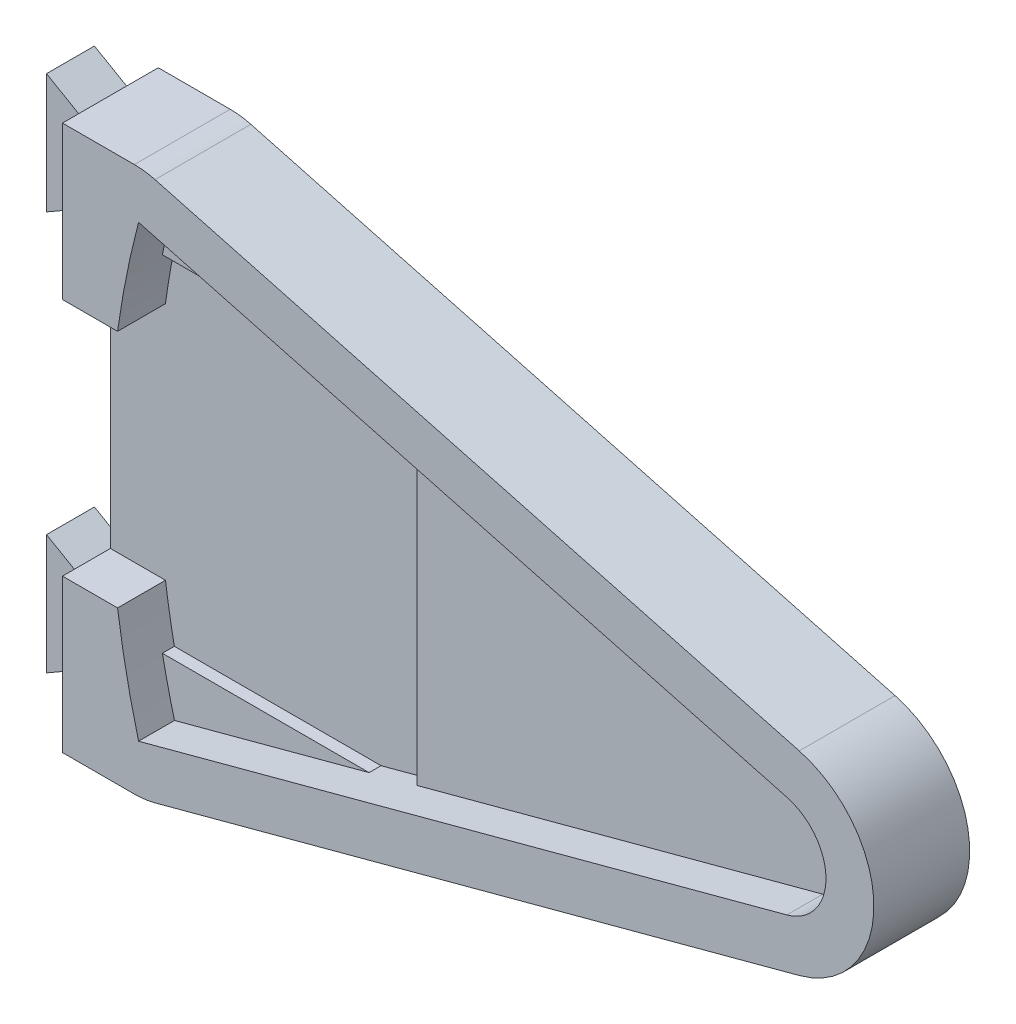
ISO-10303-21;
HEADER;
FILE_DESCRIPTION(('STEP AP214'),'2;1');
FILE_NAME('part.step','',(''),(''),'','','');
FILE_SCHEMA(('AUTOMOTIVE_DESIGN { 1 0 10303 214 1 1 1 1 }'));
ENDSEC;
DATA;
#1=APPLICATION_CONTEXT('core data for automotive mechanical design processes');
#2=APPLICATION_PROTOCOL_DEFINITION('international standard','automotive_design',2000,#1);
#3=PRODUCT_CONTEXT('',#1,'mechanical');
#4=PRODUCT('Part','Part','',(#3));
#5=PRODUCT_RELATED_PRODUCT_CATEGORY('part','',(#4));
#6=PRODUCT_DEFINITION_FORMATION('','',#4);
#7=PRODUCT_DEFINITION_CONTEXT('part definition',#1,'design');
#8=PRODUCT_DEFINITION('design','',#6,#7);
#9=PRODUCT_DEFINITION_SHAPE('','',#8);
#10=(LENGTH_UNIT() NAMED_UNIT(*) SI_UNIT(.MILLI.,.METRE.));
#11=(NAMED_UNIT(*) PLANE_ANGLE_UNIT() SI_UNIT($,.RADIAN.));
#12=(NAMED_UNIT(*) SI_UNIT($,.STERADIAN.) SOLID_ANGLE_UNIT());
#13=UNCERTAINTY_MEASURE_WITH_UNIT(LENGTH_MEASURE(1.E-05),#10,'distance_accuracy_value','');
#14=(GEOMETRIC_REPRESENTATION_CONTEXT(3) GLOBAL_UNCERTAINTY_ASSIGNED_CONTEXT((#13)) GLOBAL_UNIT_ASSIGNED_CONTEXT((#10,
#11,#12)) REPRESENTATION_CONTEXT('',''));
#15=CARTESIAN_POINT('',(0.,0.,0.));
#16=DIRECTION('',(0.,0.,1.));
#17=DIRECTION('',(1.,0.,0.));
#18=AXIS2_PLACEMENT_3D('',#15,#16,#17);
#19=CARTESIAN_POINT('',(20.4999999999858,-1.0639238671237E-11,12.));
#20=DIRECTION('',(0.,0.,-1.));
#21=DIRECTION('',(-1.,0.,0.));
#22=AXIS2_PLACEMENT_3D('',#19,#20,#21);
#23=CYLINDRICAL_SURFACE('',#22,110.12699999999);
#24=CARTESIAN_POINT('',(20.4999999999858,-1.0639238671237E-11,7.5));
#25=DIRECTION('',(0.,0.,1.));
#26=DIRECTION('',(-1.,0.,0.));
#27=AXIS2_PLACEMENT_3D('',#24,#25,#26);
#28=CIRCLE('',#27,110.126999999985);
#29=CARTESIAN_POINT('',(-87.4856820991366,-21.6113070077797,7.5));
#30=VERTEX_POINT('',#29);
#31=CARTESIAN_POINT('',(-85.9704428223746,-28.1425111567462,7.5));
#32=VERTEX_POINT('',#31);
#33=EDGE_CURVE('E445',#30,#32,#28,.T.);
#34=ORIENTED_EDGE('',*,*,#33,.F.);
#35=DIRECTION('',(0.,0.,-1.));
#36=VECTOR('',#35,1.);
#37=CARTESIAN_POINT('',(-87.4856820991366,-21.6113070077797,7.5));
#38=LINE('',#37,#36);
#39=CARTESIAN_POINT('',(-87.4856820991366,-21.6113070077797,6.));
#40=VERTEX_POINT('',#39);
#41=EDGE_CURVE('E444',#30,#40,#38,.T.);
#42=ORIENTED_EDGE('',*,*,#41,.T.);
#43=CARTESIAN_POINT('',(20.4999999999858,-1.0639238671237E-11,6.));
#44=DIRECTION('',(0.,0.,1.));
#45=DIRECTION('',(1.,0.,0.));
#46=AXIS2_PLACEMENT_3D('',#43,#44,#45);
#47=CIRCLE('',#46,110.12699999999);
#48=CARTESIAN_POINT('',(-88.6006697000578,-15.,6.));
#49=VERTEX_POINT('',#48);
#50=EDGE_CURVE('E421',#49,#40,#47,.T.);
#51=ORIENTED_EDGE('',*,*,#50,.F.);
#52=DIRECTION('',(0.,0.,-1.));
#53=VECTOR('',#52,1.);
#54=CARTESIAN_POINT('',(-88.6006697000578,-15.,12.));
#55=LINE('',#54,#53);
#56=CARTESIAN_POINT('',(-88.6006697000578,-15.,12.));
#57=VERTEX_POINT('',#56);
#58=EDGE_CURVE('E441',#57,#49,#55,.T.);
#59=ORIENTED_EDGE('',*,*,#58,.F.);
#60=CARTESIAN_POINT('',(20.4999999999858,-1.0639238671237E-11,12.));
#61=DIRECTION('',(0.,0.,1.));
#62=DIRECTION('',(1.,0.,0.));
#63=AXIS2_PLACEMENT_3D('',#60,#61,#62);
#64=CIRCLE('',#63,110.12699999999);
#65=CARTESIAN_POINT('',(-85.9704428223794,-28.1425111567494,12.));
#66=VERTEX_POINT('',#65);
#67=EDGE_CURVE('E416',#57,#66,#64,.T.);
#68=ORIENTED_EDGE('',*,*,#67,.T.);
#69=DIRECTION('',(0.,0.,-1.));
#70=VECTOR('',#69,1.);
#71=CARTESIAN_POINT('',(-85.9704428223794,-28.1425111567494,12.));
#72=LINE('',#71,#70);
#73=EDGE_CURVE('E265',#66,#32,#72,.T.);
#74=ORIENTED_EDGE('',*,*,#73,.T.);
#75=EDGE_LOOP('',(#34,#42,#51,#59,#68,#74));
#76=FACE_BOUND('',#75,.T.);
#77=ADVANCED_FACE('F41',(#76),#23,.F.);
#78=CARTESIAN_POINT('',(1.27670010738643,4.76470966679497,12.));
#79=DIRECTION('',(0.258819045102511,0.965925826289071,0.));
#80=DIRECTION('',(-0.965925826289071,0.258819045102511,0.));
#81=AXIS2_PLACEMENT_3D('',#78,#79,#80);
#82=PLANE('',#81);
#83=DIRECTION('',(0.,0.,-1.));
#84=VECTOR('',#83,1.);
#85=CARTESIAN_POINT('',(-55.5821774841933,20.,7.5));
#86=LINE('',#85,#84);
#87=CARTESIAN_POINT('',(-55.5821774841933,20.,7.5));
#88=VERTEX_POINT('',#87);
#89=CARTESIAN_POINT('',(-55.5821774841933,19.9999999999982,6.));
#90=VERTEX_POINT('',#89);
#91=EDGE_CURVE('E56',#88,#90,#86,.T.);
#92=ORIENTED_EDGE('',*,*,#91,.F.);
#93=DIRECTION('',(-0.965925826289062,0.258819045102543,0.));
#94=VECTOR('',#93,1.);
#95=CARTESIAN_POINT('',(-55.5821774841933,20.,7.5));
#96=LINE('',#95,#94);
#97=CARTESIAN_POINT('',(-4.77292040587628,6.3857005978384,7.5));
#98=VERTEX_POINT('',#97);
#99=EDGE_CURVE('E258',#98,#88,#96,.T.);
#100=ORIENTED_EDGE('',*,*,#99,.F.);
#101=DIRECTION('',(0.,0.,-1.));
#102=VECTOR('',#101,1.);
#103=CARTESIAN_POINT('',(-4.77292040587628,6.3857005978384,12.));
#104=LINE('',#103,#102);
#105=CARTESIAN_POINT('',(-4.77292040587628,6.3857005978384,12.));
#106=VERTEX_POINT('',#105);
#107=EDGE_CURVE('E257',#106,#98,#104,.T.);
#108=ORIENTED_EDGE('',*,*,#107,.F.);
#109=DIRECTION('',(0.965925826289071,-0.258819045102511,0.));
#110=VECTOR('',#109,1.);
#111=CARTESIAN_POINT('',(1.27670010738643,4.76470966679497,12.));
#112=LINE('',#111,#110);
#113=CARTESIAN_POINT('',(-85.9704428223746,28.1425111567462,12.));
#114=VERTEX_POINT('',#113);
#115=EDGE_CURVE('E413',#114,#106,#112,.T.);
#116=ORIENTED_EDGE('',*,*,#115,.F.);
#117=DIRECTION('',(0.,0.,-1.));
#118=VECTOR('',#117,1.);
#119=CARTESIAN_POINT('',(-85.9704428223746,28.1425111567462,12.));
#120=LINE('',#119,#118);
#121=CARTESIAN_POINT('',(-85.9704428223746,28.1425111567462,7.5));
#122=VERTEX_POINT('',#121);
#123=EDGE_CURVE('E268',#114,#122,#120,.T.);
#124=ORIENTED_EDGE('',*,*,#123,.T.);
#125=DIRECTION('',(-0.965925826289071,0.258819045102511,0.));
#126=VECTOR('',#125,1.);
#127=CARTESIAN_POINT('',(-85.9704428223746,28.1425111567462,7.5));
#128=LINE('',#127,#126);
#129=CARTESIAN_POINT('',(-61.5956571038259,21.6113070077797,7.5));
#130=VERTEX_POINT('',#129);
#131=EDGE_CURVE('E462',#130,#122,#128,.T.);
#132=ORIENTED_EDGE('',*,*,#131,.F.);
#133=DIRECTION('',(0.,0.,-1.));
#134=VECTOR('',#133,1.);
#135=CARTESIAN_POINT('',(-61.5956571038259,21.6113070077797,7.5));
#136=LINE('',#135,#134);
#137=CARTESIAN_POINT('',(-61.5956571038259,21.6113070077797,6.));
#138=VERTEX_POINT('',#137);
#139=EDGE_CURVE('E459',#130,#138,#136,.T.);
#140=ORIENTED_EDGE('',*,*,#139,.T.);
#141=DIRECTION('',(0.965925826289071,-0.258819045102511,0.));
#142=VECTOR('',#141,1.);
#143=CARTESIAN_POINT('',(1.27670010738643,4.76470966679497,6.));
#144=LINE('',#143,#142);
#145=EDGE_CURVE('E419',#138,#90,#144,.T.);
#146=ORIENTED_EDGE('',*,*,#145,.T.);
#147=EDGE_LOOP('',(#92,#100,#108,#116,#124,#132,#140,#146));
#148=FACE_BOUND('',#147,.T.);
#149=ADVANCED_FACE('F532',(#148),#82,.F.);
#150=CARTESIAN_POINT('',(-87.4856820991366,21.6113070077797,6.));
#151=VERTEX_POINT('',#150);
#152=CARTESIAN_POINT('',(-88.6006697000549,15.,6.));
#153=VERTEX_POINT('',#152);
#154=EDGE_CURVE('E423',#151,#153,#47,.T.);
#155=ORIENTED_EDGE('',*,*,#154,.F.);
#156=DIRECTION('',(0.,0.,-1.));
#157=VECTOR('',#156,1.);
#158=CARTESIAN_POINT('',(-87.4856820991366,21.6113070077797,7.5));
#159=LINE('',#158,#157);
#160=CARTESIAN_POINT('',(-87.4856820991366,21.6113070077797,7.5));
#161=VERTEX_POINT('',#160);
#162=EDGE_CURVE('E457',#161,#151,#159,.T.);
#163=ORIENTED_EDGE('',*,*,#162,.F.);
#164=CARTESIAN_POINT('',(20.4999999999858,-1.0639238671237E-11,7.5));
#165=DIRECTION('',(0.,0.,1.));
#166=DIRECTION('',(1.,0.,0.));
#167=AXIS2_PLACEMENT_3D('',#164,#165,#166);
#168=CIRCLE('',#167,110.12699999999);
#169=EDGE_CURVE('E464',#122,#161,#168,.T.);
#170=ORIENTED_EDGE('',*,*,#169,.F.);
#171=ORIENTED_EDGE('',*,*,#123,.F.);
#172=CARTESIAN_POINT('',(-88.6006697000549,15.,12.));
#173=VERTEX_POINT('',#172);
#174=EDGE_CURVE('E270',#114,#173,#64,.T.);
#175=ORIENTED_EDGE('',*,*,#174,.T.);
#176=DIRECTION('',(0.,0.,-1.));
#177=VECTOR('',#176,1.);
#178=CARTESIAN_POINT('',(-88.6006697000549,15.,12.));
#179=LINE('',#178,#177);
#180=EDGE_CURVE('E480',#153,#173,#179,.F.);
#181=ORIENTED_EDGE('',*,*,#180,.F.);
#182=EDGE_LOOP('',(#155,#163,#170,#171,#175,#181));
#183=FACE_BOUND('',#182,.T.);
#184=ADVANCED_FACE('F534',(#183),#23,.F.);
#185=CARTESIAN_POINT('',(1.27670010738684,-4.76470966679645,12.));
#186=DIRECTION('',(0.258819045102514,-0.96592582628907,0.));
#187=DIRECTION('',(0.96592582628907,0.258819045102514,0.));
#188=AXIS2_PLACEMENT_3D('',#185,#186,#187);
#189=PLANE('',#188);
#190=DIRECTION('',(0.,0.,-1.));
#191=VECTOR('',#190,1.);
#192=CARTESIAN_POINT('',(-55.5821774841933,-20.,7.5));
#193=LINE('',#192,#191);
#194=CARTESIAN_POINT('',(-55.5821774841933,-20.,7.5));
#195=VERTEX_POINT('',#194);
#196=CARTESIAN_POINT('',(-55.5821774841933,-20.,6.));
#197=VERTEX_POINT('',#196);
#198=EDGE_CURVE('E854',#195,#197,#193,.T.);
#199=ORIENTED_EDGE('',*,*,#198,.T.);
#200=DIRECTION('',(-0.96592582628907,-0.258819045102514,0.));
#201=VECTOR('',#200,1.);
#202=CARTESIAN_POINT('',(1.27670010738684,-4.76470966679645,6.));
#203=LINE('',#202,#201);
#204=CARTESIAN_POINT('',(-61.5956571038191,-21.6113070077797,6.));
#205=VERTEX_POINT('',#204);
#206=EDGE_CURVE('E273',#197,#205,#203,.T.);
#207=ORIENTED_EDGE('',*,*,#206,.T.);
#208=DIRECTION('',(0.,0.,-1.));
#209=VECTOR('',#208,1.);
#210=CARTESIAN_POINT('',(-61.5956571038259,-21.6113070077797,7.5));
#211=LINE('',#210,#209);
#212=CARTESIAN_POINT('',(-61.5956571038259,-21.6113070077797,7.5));
#213=VERTEX_POINT('',#212);
#214=EDGE_CURVE('E64',#213,#205,#211,.T.);
#215=ORIENTED_EDGE('',*,*,#214,.F.);
#216=DIRECTION('',(0.965925826289071,0.258819045102511,0.));
#217=VECTOR('',#216,1.);
#218=CARTESIAN_POINT('',(-85.9704428223746,-28.1425111567462,7.5));
#219=LINE('',#218,#217);
#220=EDGE_CURVE('E448',#32,#213,#219,.T.);
#221=ORIENTED_EDGE('',*,*,#220,.F.);
#222=ORIENTED_EDGE('',*,*,#73,.F.);
#223=DIRECTION('',(-0.96592582628907,-0.258819045102514,0.));
#224=VECTOR('',#223,1.);
#225=CARTESIAN_POINT('',(1.27670010738684,-4.76470966679645,12.));
#226=LINE('',#225,#224);
#227=CARTESIAN_POINT('',(-4.77292040587472,-6.38570059783959,12.));
#228=VERTEX_POINT('',#227);
#229=EDGE_CURVE('E263',#228,#66,#226,.T.);
#230=ORIENTED_EDGE('',*,*,#229,.F.);
#231=DIRECTION('',(0.,0.,-1.));
#232=VECTOR('',#231,1.);
#233=CARTESIAN_POINT('',(-4.77292040587472,-6.38570059783959,12.));
#234=LINE('',#233,#232);
#235=CARTESIAN_POINT('',(-4.77292040587473,-6.38570059783959,7.5));
#236=VERTEX_POINT('',#235);
#237=EDGE_CURVE('E254',#228,#236,#234,.T.);
#238=ORIENTED_EDGE('',*,*,#237,.T.);
#239=DIRECTION('',(0.96592582628907,0.258819045102514,0.));
#240=VECTOR('',#239,1.);
#241=CARTESIAN_POINT('',(-4.77292040587472,-6.38570059783959,7.5));
#242=LINE('',#241,#240);
#243=EDGE_CURVE('E239',#195,#236,#242,.T.);
#244=ORIENTED_EDGE('',*,*,#243,.F.);
#245=EDGE_LOOP('',(#199,#207,#215,#221,#222,#230,#238,#244));
#246=FACE_BOUND('',#245,.T.);
#247=ADVANCED_FACE('F260',(#246),#189,.F.);
#248=CARTESIAN_POINT('',(0.,0.,6.));
#249=DIRECTION('',(0.,0.,1.));
#250=DIRECTION('',(1.,0.,0.));
#251=AXIS2_PLACEMENT_3D('',#248,#249,#250);
#252=PLANE('',#251);
#253=ORIENTED_EDGE('',*,*,#206,.F.);
#254=DIRECTION('',(0.,-1.,0.));
#255=VECTOR('',#254,1.);
#256=CARTESIAN_POINT('',(-55.5821774841933,20.,6.));
#257=LINE('',#256,#255);
#258=EDGE_CURVE('E249',#90,#197,#257,.T.);
#259=ORIENTED_EDGE('',*,*,#258,.F.);
#260=ORIENTED_EDGE('',*,*,#145,.F.);
#261=DIRECTION('',(1.,0.,0.));
#262=VECTOR('',#261,1.);
#263=CARTESIAN_POINT('',(-87.4856820991366,21.6113070077797,6.));
#264=LINE('',#263,#262);
#265=EDGE_CURVE('E450',#151,#138,#264,.T.);
#266=ORIENTED_EDGE('',*,*,#265,.F.);
#267=ORIENTED_EDGE('',*,*,#154,.T.);
#268=DIRECTION('',(-1.,0.,0.));
#269=VECTOR('',#268,1.);
#270=CARTESIAN_POINT('',(-85.5000000000038,15.,6.));
#271=LINE('',#270,#269);
#272=CARTESIAN_POINT('',(-95.5000000000038,15.,6.));
#273=VERTEX_POINT('',#272);
#274=EDGE_CURVE('E482',#153,#273,#271,.T.);
#275=ORIENTED_EDGE('',*,*,#274,.T.);
#276=DIRECTION('',(0.,-1.,0.));
#277=VECTOR('',#276,1.);
#278=CARTESIAN_POINT('',(-95.5000000000038,15.,6.));
#279=LINE('',#278,#277);
#280=CARTESIAN_POINT('',(-95.5000000000038,-15.,6.));
#281=VERTEX_POINT('',#280);
#282=EDGE_CURVE('E473',#273,#281,#279,.T.);
#283=ORIENTED_EDGE('',*,*,#282,.T.);
#284=DIRECTION('',(-1.,0.,0.));
#285=VECTOR('',#284,1.);
#286=CARTESIAN_POINT('',(-85.5000000000038,-15.,6.));
#287=LINE('',#286,#285);
#288=EDGE_CURVE('E436',#49,#281,#287,.T.);
#289=ORIENTED_EDGE('',*,*,#288,.F.);
#290=ORIENTED_EDGE('',*,*,#50,.T.);
#291=DIRECTION('',(-1.,0.,0.));
#292=VECTOR('',#291,1.);
#293=CARTESIAN_POINT('',(-87.4856820991366,-21.6113070077797,6.));
#294=LINE('',#293,#292);
#295=EDGE_CURVE('E434',#205,#40,#294,.T.);
#296=ORIENTED_EDGE('',*,*,#295,.F.);
#297=EDGE_LOOP('',(#253,#259,#260,#266,#267,#275,#283,#289,#290,#296));
#298=FACE_BOUND('',#297,.T.);
#299=ADVANCED_FACE('F433',(#298),#252,.T.);
#300=CARTESIAN_POINT('',(-95.5000000000038,0.,6.));
#301=DIRECTION('',(1.,0.,0.));
#302=DIRECTION('',(0.,1.,0.));
#303=AXIS2_PLACEMENT_3D('',#300,#301,#302);
#304=PLANE('',#303);
#305=DIRECTION('',(0.,1.,0.));
#306=VECTOR('',#305,1.);
#307=CARTESIAN_POINT('',(-95.5000000000038,0.,12.));
#308=LINE('',#307,#306);
#309=CARTESIAN_POINT('',(-95.5000000000037,-34.1425111567482,12.));
#310=VERTEX_POINT('',#309);
#311=CARTESIAN_POINT('',(-95.5000000000038,-15.,12.));
#312=VERTEX_POINT('',#311);
#313=EDGE_CURVE('E298',#310,#312,#308,.T.);
#314=ORIENTED_EDGE('',*,*,#313,.T.);
#315=DIRECTION('',(0.,0.,1.));
#316=VECTOR('',#315,1.);
#317=CARTESIAN_POINT('',(-95.5000000000038,-15.,12.));
#318=LINE('',#317,#316);
#319=EDGE_CURVE('E475',#281,#312,#318,.T.);
#320=ORIENTED_EDGE('',*,*,#319,.F.);
#321=ORIENTED_EDGE('',*,*,#282,.F.);
#322=DIRECTION('',(0.,0.,-1.));
#323=VECTOR('',#322,1.);
#324=CARTESIAN_POINT('',(-95.5000000000038,15.,12.));
#325=LINE('',#324,#323);
#326=CARTESIAN_POINT('',(-95.5000000000038,15.,12.));
#327=VERTEX_POINT('',#326);
#328=EDGE_CURVE('E470',#327,#273,#325,.T.);
#329=ORIENTED_EDGE('',*,*,#328,.F.);
#330=CARTESIAN_POINT('',(-95.5000000000038,34.1425111567487,12.));
#331=VERTEX_POINT('',#330);
#332=EDGE_CURVE('E297',#327,#331,#308,.T.);
#333=ORIENTED_EDGE('',*,*,#332,.T.);
#334=DIRECTION('',(0.,0.,-1.));
#335=VECTOR('',#334,1.);
#336=CARTESIAN_POINT('',(-95.5000000000038,34.1425111567487,6.));
#337=LINE('',#336,#335);
#338=CARTESIAN_POINT('',(-95.5000000000038,34.1425111567487,0.));
#339=VERTEX_POINT('',#338);
#340=EDGE_CURVE('E330',#331,#339,#337,.T.);
#341=ORIENTED_EDGE('',*,*,#340,.T.);
#342=DIRECTION('',(0.,-1.,0.));
#343=VECTOR('',#342,1.);
#344=CARTESIAN_POINT('',(-95.5000000000038,0.,0.));
#345=LINE('',#344,#343);
#346=CARTESIAN_POINT('',(-95.5000000000037,27.881197846483,0.));
#347=VERTEX_POINT('',#346);
#348=EDGE_CURVE('E323',#339,#347,#345,.T.);
#349=ORIENTED_EDGE('',*,*,#348,.T.);
#350=DIRECTION('',(0.,0.,-1.));
#351=VECTOR('',#350,1.);
#352=CARTESIAN_POINT('',(-95.5000000000037,27.881197846483,6.));
#353=LINE('',#352,#351);
#354=CARTESIAN_POINT('',(-95.5000000000037,27.881197846483,6.));
#355=VERTEX_POINT('',#354);
#356=EDGE_CURVE('E422',#355,#347,#353,.T.);
#357=ORIENTED_EDGE('',*,*,#356,.F.);
#358=DIRECTION('',(0.,1.,0.));
#359=VECTOR('',#358,1.);
#360=CARTESIAN_POINT('',(-95.5000000000037,27.881197846483,6.));
#361=LINE('',#360,#359);
#362=CARTESIAN_POINT('',(-95.5000000000037,22.118802153517,6.));
#363=VERTEX_POINT('',#362);
#364=EDGE_CURVE('E488',#363,#355,#361,.T.);
#365=ORIENTED_EDGE('',*,*,#364,.F.);
#366=DIRECTION('',(0.,0.,-1.));
#367=VECTOR('',#366,1.);
#368=CARTESIAN_POINT('',(-95.5000000000037,22.118802153517,6.));
#369=LINE('',#368,#367);
#370=CARTESIAN_POINT('',(-95.5000000000038,22.118802153517,0.));
#371=VERTEX_POINT('',#370);
#372=EDGE_CURVE('E383',#363,#371,#369,.T.);
#373=ORIENTED_EDGE('',*,*,#372,.T.);
#374=CARTESIAN_POINT('',(-95.5000000000037,-22.118802153517,0.));
#375=VERTEX_POINT('',#374);
#376=EDGE_CURVE('E327',#371,#375,#345,.T.);
#377=ORIENTED_EDGE('',*,*,#376,.T.);
#378=DIRECTION('',(0.,0.,-1.));
#379=VECTOR('',#378,1.);
#380=CARTESIAN_POINT('',(-95.5000000000037,-22.118802153517,6.));
#381=LINE('',#380,#379);
#382=CARTESIAN_POINT('',(-95.5000000000037,-22.118802153517,6.));
#383=VERTEX_POINT('',#382);
#384=EDGE_CURVE('E380',#383,#375,#381,.T.);
#385=ORIENTED_EDGE('',*,*,#384,.F.);
#386=DIRECTION('',(0.,1.,0.));
#387=VECTOR('',#386,1.);
#388=CARTESIAN_POINT('',(-95.5000000000037,-22.118802153517,6.));
#389=LINE('',#388,#387);
#390=CARTESIAN_POINT('',(-95.5000000000037,-27.881197846483,6.));
#391=VERTEX_POINT('',#390);
#392=EDGE_CURVE('E408',#391,#383,#389,.T.);
#393=ORIENTED_EDGE('',*,*,#392,.F.);
#394=DIRECTION('',(0.,0.,-1.));
#395=VECTOR('',#394,1.);
#396=CARTESIAN_POINT('',(-95.5000000000037,-27.881197846483,6.));
#397=LINE('',#396,#395);
#398=CARTESIAN_POINT('',(-95.5000000000037,-27.881197846483,0.));
#399=VERTEX_POINT('',#398);
#400=EDGE_CURVE('E511',#391,#399,#397,.T.);
#401=ORIENTED_EDGE('',*,*,#400,.T.);
#402=CARTESIAN_POINT('',(-95.5000000000037,-34.1425111567482,0.));
#403=VERTEX_POINT('',#402);
#404=EDGE_CURVE('E322',#399,#403,#345,.T.);
#405=ORIENTED_EDGE('',*,*,#404,.T.);
#406=DIRECTION('',(0.,0.,-1.));
#407=VECTOR('',#406,1.);
#408=CARTESIAN_POINT('',(-95.5000000000037,-34.1425111567482,6.));
#409=LINE('',#408,#407);
#410=EDGE_CURVE('E326',#310,#403,#409,.T.);
#411=ORIENTED_EDGE('',*,*,#410,.F.);
#412=EDGE_LOOP('',(#314,#320,#321,#329,#333,#341,#349,#357,#365,#373,#377,#385,#393,#401,#405,#411));
#413=FACE_BOUND('',#412,.T.);
#414=ADVANCED_FACE('F378',(#413),#304,.F.);
#415=CARTESIAN_POINT('',(0.,-34.1425111567482,6.));
#416=DIRECTION('',(0.,1.,0.));
#417=DIRECTION('',(0.,0.,1.));
#418=AXIS2_PLACEMENT_3D('',#415,#416,#417);
#419=PLANE('',#418);
#420=DIRECTION('',(1.,0.,0.));
#421=VECTOR('',#420,1.);
#422=CARTESIAN_POINT('',(0.,-34.1425111567482,0.));
#423=LINE('',#422,#421);
#424=CARTESIAN_POINT('',(-86.4970528127294,-34.1425111567482,0.));
#425=VERTEX_POINT('',#424);
#426=EDGE_CURVE('E304',#403,#425,#423,.T.);
#427=ORIENTED_EDGE('',*,*,#426,.T.);
#428=DIRECTION('',(0.,0.,-1.));
#429=VECTOR('',#428,1.);
#430=CARTESIAN_POINT('',(-86.4970528127294,-34.1425111567482,6.));
#431=LINE('',#430,#429);
#432=CARTESIAN_POINT('',(-86.4970528127294,-34.1425111567482,12.));
#433=VERTEX_POINT('',#432);
#434=EDGE_CURVE('E11',#433,#425,#431,.T.);
#435=ORIENTED_EDGE('',*,*,#434,.F.);
#436=DIRECTION('',(-1.,0.,0.));
#437=VECTOR('',#436,1.);
#438=CARTESIAN_POINT('',(0.,-34.1425111567482,12.));
#439=LINE('',#438,#437);
#440=EDGE_CURVE('E301',#433,#310,#439,.T.);
#441=ORIENTED_EDGE('',*,*,#440,.T.);
#442=ORIENTED_EDGE('',*,*,#410,.T.);
#443=EDGE_LOOP('',(#427,#435,#441,#442));
#444=FACE_BOUND('',#443,.T.);
#445=ADVANCED_FACE('F43',(#444),#419,.F.);
#446=CARTESIAN_POINT('',(-86.4970528127293,-24.1425111567482,6.));
#447=DIRECTION('',(0.,0.,-1.));
#448=DIRECTION('',(-1.,0.,0.));
#449=AXIS2_PLACEMENT_3D('',#446,#447,#448);
#450=CYLINDRICAL_SURFACE('',#449,10.);
#451=CARTESIAN_POINT('',(-86.4970528127293,-24.1425111567482,0.));
#452=DIRECTION('',(0.,0.,1.));
#453=DIRECTION('',(1.,0.,0.));
#454=AXIS2_PLACEMENT_3D('',#451,#452,#453);
#455=CIRCLE('',#454,10.);
#456=CARTESIAN_POINT('',(-83.9088623617041,-33.8017694196389,0.));
#457=VERTEX_POINT('',#456);
#458=EDGE_CURVE('E307',#425,#457,#455,.T.);
#459=ORIENTED_EDGE('',*,*,#458,.T.);
#460=DIRECTION('',(0.,0.,-1.));
#461=VECTOR('',#460,1.);
#462=CARTESIAN_POINT('',(-83.9088623617041,-33.8017694196389,6.));
#463=LINE('',#462,#461);
#464=CARTESIAN_POINT('',(-83.9088623617042,-33.8017694196389,12.));
#465=VERTEX_POINT('',#464);
#466=EDGE_CURVE('E49',#465,#457,#463,.T.);
#467=ORIENTED_EDGE('',*,*,#466,.F.);
#468=CARTESIAN_POINT('',(-86.4970528127293,-24.1425111567482,12.));
#469=DIRECTION('',(0.,0.,1.));
#470=DIRECTION('',(1.,0.,0.));
#471=AXIS2_PLACEMENT_3D('',#468,#469,#470);
#472=CIRCLE('',#471,10.);
#473=EDGE_CURVE('E279',#433,#465,#472,.T.);
#474=ORIENTED_EDGE('',*,*,#473,.F.);
#475=ORIENTED_EDGE('',*,*,#434,.T.);
#476=EDGE_LOOP('',(#459,#467,#474,#475));
#477=FACE_BOUND('',#476,.T.);
#478=ADVANCED_FACE('F366',(#477),#450,.T.);
#479=CARTESIAN_POINT('',(2.8296143780016,-10.5602646245297,6.));
#480=DIRECTION('',(-0.258819045102514,0.96592582628907,0.));
#481=DIRECTION('',(-0.96592582628907,-0.258819045102514,0.));
#482=AXIS2_PLACEMENT_3D('',#479,#480,#481);
#483=PLANE('',#482);
#484=DIRECTION('',(0.96592582628907,0.258819045102514,0.));
#485=VECTOR('',#484,1.);
#486=CARTESIAN_POINT('',(2.8296143780016,-10.5602646245297,0.));
#487=LINE('',#486,#485);
#488=CARTESIAN_POINT('',(-3.22000613526089,-12.181255555573,0.));
#489=VERTEX_POINT('',#488);
#490=EDGE_CURVE('E309',#457,#489,#487,.T.);
#491=ORIENTED_EDGE('',*,*,#490,.T.);
#492=DIRECTION('',(0.,0.,-1.));
#493=VECTOR('',#492,1.);
#494=CARTESIAN_POINT('',(-3.22000613526089,-12.181255555573,6.));
#495=LINE('',#494,#493);
#496=CARTESIAN_POINT('',(-3.22000613526089,-12.181255555573,12.));
#497=VERTEX_POINT('',#496);
#498=EDGE_CURVE('E339',#497,#489,#495,.T.);
#499=ORIENTED_EDGE('',*,*,#498,.F.);
#500=DIRECTION('',(-0.96592582628907,-0.258819045102514,0.));
#501=VECTOR('',#500,1.);
#502=CARTESIAN_POINT('',(2.8296143780016,-10.5602646245296,12.));
#503=LINE('',#502,#501);
#504=EDGE_CURVE('E282',#497,#465,#503,.T.);
#505=ORIENTED_EDGE('',*,*,#504,.T.);
#506=ORIENTED_EDGE('',*,*,#466,.T.);
#507=EDGE_LOOP('',(#491,#499,#505,#506));
#508=FACE_BOUND('',#507,.T.);
#509=ADVANCED_FACE('F344',(#508),#483,.F.);
#510=CARTESIAN_POINT('',(-6.48396372417305,5.03610879276146E-13,6.));
#511=DIRECTION('',(0.,0.,-1.));
#512=DIRECTION('',(-1.,0.,0.));
#513=AXIS2_PLACEMENT_3D('',#510,#511,#512);
#514=CYLINDRICAL_SURFACE('',#513,12.6109637241731);
#515=CARTESIAN_POINT('',(-6.48396372417305,5.03610879276146E-13,0.));
#516=DIRECTION('',(0.,0.,1.));
#517=DIRECTION('',(1.,0.,0.));
#518=AXIS2_PLACEMENT_3D('',#515,#516,#517);
#519=CIRCLE('',#518,12.6109637241731);
#520=CARTESIAN_POINT('',(-3.22000613525971,12.1812555555737,0.));
#521=VERTEX_POINT('',#520);
#522=EDGE_CURVE('E311',#489,#521,#519,.T.);
#523=ORIENTED_EDGE('',*,*,#522,.T.);
#524=DIRECTION('',(0.,0.,-1.));
#525=VECTOR('',#524,1.);
#526=CARTESIAN_POINT('',(-3.22000613525971,12.1812555555737,6.));
#527=LINE('',#526,#525);
#528=CARTESIAN_POINT('',(-3.22000613525971,12.1812555555737,12.));
#529=VERTEX_POINT('',#528);
#530=EDGE_CURVE('E336',#529,#521,#527,.T.);
#531=ORIENTED_EDGE('',*,*,#530,.F.);
#532=CARTESIAN_POINT('',(-6.48396372417305,5.03610879276146E-13,12.));
#533=DIRECTION('',(0.,0.,1.));
#534=DIRECTION('',(1.,0.,0.));
#535=AXIS2_PLACEMENT_3D('',#532,#533,#534);
#536=CIRCLE('',#535,12.6109637241731);
#537=EDGE_CURVE('E285',#497,#529,#536,.T.);
#538=ORIENTED_EDGE('',*,*,#537,.F.);
#539=ORIENTED_EDGE('',*,*,#498,.T.);
#540=EDGE_LOOP('',(#523,#531,#538,#539));
#541=FACE_BOUND('',#540,.T.);
#542=ADVANCED_FACE('F354',(#541),#514,.T.);
#543=CARTESIAN_POINT('',(2.82961437800182,10.5602646245306,6.));
#544=DIRECTION('',(-0.258819045102512,-0.965925826289071,0.));
#545=DIRECTION('',(0.965925826289071,-0.258819045102512,0.));
#546=AXIS2_PLACEMENT_3D('',#543,#544,#545);
#547=PLANE('',#546);
#548=DIRECTION('',(-0.965925826289071,0.258819045102512,0.));
#549=VECTOR('',#548,1.);
#550=CARTESIAN_POINT('',(2.82961437800182,10.5602646245306,0.));
#551=LINE('',#550,#549);
#552=CARTESIAN_POINT('',(-83.9088623617026,33.8017694196393,0.));
#553=VERTEX_POINT('',#552);
#554=EDGE_CURVE('E313',#521,#553,#551,.T.);
#555=ORIENTED_EDGE('',*,*,#554,.T.);
#556=DIRECTION('',(0.,0.,-1.));
#557=VECTOR('',#556,1.);
#558=CARTESIAN_POINT('',(-83.9088623617026,33.8017694196393,6.));
#559=LINE('',#558,#557);
#560=CARTESIAN_POINT('',(-83.9088623617027,33.8017694196393,12.));
#561=VERTEX_POINT('',#560);
#562=EDGE_CURVE('E334',#561,#553,#559,.T.);
#563=ORIENTED_EDGE('',*,*,#562,.F.);
#564=DIRECTION('',(0.965925826289071,-0.258819045102512,0.));
#565=VECTOR('',#564,1.);
#566=CARTESIAN_POINT('',(2.82961437800182,10.5602646245306,12.));
#567=LINE('',#566,#565);
#568=EDGE_CURVE('E288',#561,#529,#567,.T.);
#569=ORIENTED_EDGE('',*,*,#568,.T.);
#570=ORIENTED_EDGE('',*,*,#530,.T.);
#571=EDGE_LOOP('',(#555,#563,#569,#570));
#572=FACE_BOUND('',#571,.T.);
#573=ADVANCED_FACE('F357',(#572),#547,.F.);
#574=CARTESIAN_POINT('',(-86.4970528127278,24.1425111567486,6.));
#575=DIRECTION('',(0.,0.,-1.));
#576=DIRECTION('',(-1.,0.,0.));
#577=AXIS2_PLACEMENT_3D('',#574,#575,#576);
#578=CYLINDRICAL_SURFACE('',#577,10.);
#579=CARTESIAN_POINT('',(-86.4970528127278,24.1425111567486,0.));
#580=DIRECTION('',(0.,0.,1.));
#581=DIRECTION('',(1.,0.,0.));
#582=AXIS2_PLACEMENT_3D('',#579,#580,#581);
#583=CIRCLE('',#582,10.);
#584=CARTESIAN_POINT('',(-86.497052812729,34.1425111567486,0.));
#585=VERTEX_POINT('',#584);
#586=EDGE_CURVE('E316',#585,#553,#583,.F.);
#587=ORIENTED_EDGE('',*,*,#586,.F.);
#588=DIRECTION('',(0.,0.,-1.));
#589=VECTOR('',#588,1.);
#590=CARTESIAN_POINT('',(-86.497052812729,34.1425111567486,6.));
#591=LINE('',#590,#589);
#592=CARTESIAN_POINT('',(-86.497052812729,34.1425111567486,12.));
#593=VERTEX_POINT('',#592);
#594=EDGE_CURVE('E332',#593,#585,#591,.T.);
#595=ORIENTED_EDGE('',*,*,#594,.F.);
#596=CARTESIAN_POINT('',(-86.4970528127278,24.1425111567486,12.));
#597=DIRECTION('',(0.,0.,1.));
#598=DIRECTION('',(1.,0.,0.));
#599=AXIS2_PLACEMENT_3D('',#596,#597,#598);
#600=CIRCLE('',#599,10.);
#601=EDGE_CURVE('E291',#561,#593,#600,.T.);
#602=ORIENTED_EDGE('',*,*,#601,.F.);
#603=ORIENTED_EDGE('',*,*,#562,.T.);
#604=EDGE_LOOP('',(#587,#595,#602,#603));
#605=FACE_BOUND('',#604,.T.);
#606=ADVANCED_FACE('F763',(#605),#578,.T.);
#607=CARTESIAN_POINT('',(6.05241697505847E-13,34.142511156747,6.));
#608=DIRECTION('',(0.,1.,0.));
#609=DIRECTION('',(-1.,0.,0.));
#610=AXIS2_PLACEMENT_3D('',#607,#608,#609);
#611=PLANE('',#610);
#612=DIRECTION('',(1.,0.,0.));
#613=VECTOR('',#612,1.);
#614=CARTESIAN_POINT('',(6.05241697505847E-13,34.142511156747,0.));
#615=LINE('',#614,#613);
#616=EDGE_CURVE('E319',#339,#585,#615,.T.);
#617=ORIENTED_EDGE('',*,*,#616,.F.);
#618=ORIENTED_EDGE('',*,*,#340,.F.);
#619=DIRECTION('',(1.,0.,0.));
#620=VECTOR('',#619,1.);
#621=CARTESIAN_POINT('',(6.05241697505847E-13,34.142511156747,12.));
#622=LINE('',#621,#620);
#623=EDGE_CURVE('E294',#331,#593,#622,.T.);
#624=ORIENTED_EDGE('',*,*,#623,.T.);
#625=ORIENTED_EDGE('',*,*,#594,.T.);
#626=EDGE_LOOP('',(#617,#618,#624,#625));
#627=FACE_BOUND('',#626,.T.);
#628=ADVANCED_FACE('F561',(#627),#611,.T.);
#629=CARTESIAN_POINT('',(0.,0.,0.));
#630=DIRECTION('',(0.,0.,1.));
#631=DIRECTION('',(1.,0.,0.));
#632=AXIS2_PLACEMENT_3D('',#629,#630,#631);
#633=PLANE('',#632);
#634=ORIENTED_EDGE('',*,*,#426,.F.);
#635=ORIENTED_EDGE('',*,*,#404,.F.);
#636=DIRECTION('',(0.866025403784439,0.499999999999999,0.));
#637=VECTOR('',#636,1.);
#638=CARTESIAN_POINT('',(-95.5000000000037,-27.881197846483,0.));
#639=LINE('',#638,#637);
#640=CARTESIAN_POINT('',(-103.500000000004,-32.5,0.));
#641=VERTEX_POINT('',#640);
#642=EDGE_CURVE('E370',#641,#399,#639,.T.);
#643=ORIENTED_EDGE('',*,*,#642,.F.);
#644=DIRECTION('',(0.,-1.,0.));
#645=VECTOR('',#644,1.);
#646=CARTESIAN_POINT('',(-103.500000000004,-32.5,0.));
#647=LINE('',#646,#645);
#648=CARTESIAN_POINT('',(-103.500000000004,-17.5,0.));
#649=VERTEX_POINT('',#648);
#650=EDGE_CURVE('E390',#649,#641,#647,.T.);
#651=ORIENTED_EDGE('',*,*,#650,.F.);
#652=DIRECTION('',(-0.86602540378444,0.499999999999997,0.));
#653=VECTOR('',#652,1.);
#654=CARTESIAN_POINT('',(-103.500000000004,-17.5,0.));
#655=LINE('',#654,#653);
#656=EDGE_CURVE('E388',#375,#649,#655,.T.);
#657=ORIENTED_EDGE('',*,*,#656,.F.);
#658=ORIENTED_EDGE('',*,*,#376,.F.);
#659=DIRECTION('',(0.86602540378444,0.499999999999998,0.));
#660=VECTOR('',#659,1.);
#661=CARTESIAN_POINT('',(-103.500000000004,17.5,0.));
#662=LINE('',#661,#660);
#663=CARTESIAN_POINT('',(-103.500000000004,17.5,0.));
#664=VERTEX_POINT('',#663);
#665=EDGE_CURVE('E387',#664,#371,#662,.T.);
#666=ORIENTED_EDGE('',*,*,#665,.F.);
#667=DIRECTION('',(0.,-1.,0.));
#668=VECTOR('',#667,1.);
#669=CARTESIAN_POINT('',(-103.500000000004,32.5,0.));
#670=LINE('',#669,#668);
#671=CARTESIAN_POINT('',(-103.500000000004,32.5,0.));
#672=VERTEX_POINT('',#671);
#673=EDGE_CURVE('E498',#672,#664,#670,.T.);
#674=ORIENTED_EDGE('',*,*,#673,.F.);
#675=DIRECTION('',(-0.86602540378444,0.499999999999998,0.));
#676=VECTOR('',#675,1.);
#677=CARTESIAN_POINT('',(-95.5000000000037,27.881197846483,0.));
#678=LINE('',#677,#676);
#679=EDGE_CURVE('E405',#347,#672,#678,.T.);
#680=ORIENTED_EDGE('',*,*,#679,.F.);
#681=ORIENTED_EDGE('',*,*,#348,.F.);
#682=ORIENTED_EDGE('',*,*,#616,.T.);
#683=ORIENTED_EDGE('',*,*,#586,.T.);
#684=ORIENTED_EDGE('',*,*,#554,.F.);
#685=ORIENTED_EDGE('',*,*,#522,.F.);
#686=ORIENTED_EDGE('',*,*,#490,.F.);
#687=ORIENTED_EDGE('',*,*,#458,.F.);
#688=EDGE_LOOP('',(#634,#635,#643,#651,#657,#658,#666,#674,#680,#681,#682,#683,#684,#685,#686,#687));
#689=FACE_BOUND('',#688,.T.);
#690=ADVANCED_FACE('F351',(#689),#633,.F.);
#691=CARTESIAN_POINT('',(-86.4970528127293,-24.1425111567482,12.));
#692=DIRECTION('',(0.,0.,1.));
#693=DIRECTION('',(1.,0.,0.));
#694=AXIS2_PLACEMENT_3D('',#691,#692,#693);
#695=PLANE('',#694);
#696=DIRECTION('',(-1.,0.,0.));
#697=VECTOR('',#696,1.);
#698=CARTESIAN_POINT('',(-85.5000000000038,-15.,12.));
#699=LINE('',#698,#697);
#700=EDGE_CURVE('E478',#57,#312,#699,.T.);
#701=ORIENTED_EDGE('',*,*,#700,.T.);
#702=ORIENTED_EDGE('',*,*,#313,.F.);
#703=ORIENTED_EDGE('',*,*,#440,.F.);
#704=ORIENTED_EDGE('',*,*,#473,.T.);
#705=ORIENTED_EDGE('',*,*,#504,.F.);
#706=ORIENTED_EDGE('',*,*,#537,.T.);
#707=ORIENTED_EDGE('',*,*,#568,.F.);
#708=ORIENTED_EDGE('',*,*,#601,.T.);
#709=ORIENTED_EDGE('',*,*,#623,.F.);
#710=ORIENTED_EDGE('',*,*,#332,.F.);
#711=DIRECTION('',(-1.,0.,0.));
#712=VECTOR('',#711,1.);
#713=CARTESIAN_POINT('',(-85.5000000000038,15.,12.));
#714=LINE('',#713,#712);
#715=EDGE_CURVE('E477',#173,#327,#714,.T.);
#716=ORIENTED_EDGE('',*,*,#715,.F.);
#717=ORIENTED_EDGE('',*,*,#174,.F.);
#718=ORIENTED_EDGE('',*,*,#115,.T.);
#719=CARTESIAN_POINT('',(-6.48396372417305,-8.04911692853238E-13,12.));
#720=DIRECTION('',(0.,0.,1.));
#721=DIRECTION('',(1.,0.,0.));
#722=AXIS2_PLACEMENT_3D('',#719,#720,#721);
#723=CIRCLE('',#722,6.61096372417305);
#724=EDGE_CURVE('E411',#228,#106,#723,.T.);
#725=ORIENTED_EDGE('',*,*,#724,.F.);
#726=ORIENTED_EDGE('',*,*,#229,.T.);
#727=ORIENTED_EDGE('',*,*,#67,.F.);
#728=EDGE_LOOP('',(#701,#702,#703,#704,#705,#706,#707,#708,#709,#710,#716,#717,#718,#725,#726,#727));
#729=FACE_BOUND('',#728,.T.);
#730=ADVANCED_FACE('F362',(#729),#695,.T.);
#731=CARTESIAN_POINT('',(-6.48396372417305,-8.04911692853238E-13,12.));
#732=DIRECTION('',(0.,0.,-1.));
#733=DIRECTION('',(-1.,0.,0.));
#734=AXIS2_PLACEMENT_3D('',#731,#732,#733);
#735=CYLINDRICAL_SURFACE('',#734,6.61096372417305);
#736=CARTESIAN_POINT('',(-6.48396372417305,-8.04911692853238E-13,7.5));
#737=DIRECTION('',(0.,0.,1.));
#738=DIRECTION('',(1.,0.,0.));
#739=AXIS2_PLACEMENT_3D('',#736,#737,#738);
#740=CIRCLE('',#739,6.61096372417305);
#741=EDGE_CURVE('E242',#236,#98,#740,.T.);
#742=ORIENTED_EDGE('',*,*,#741,.F.);
#743=ORIENTED_EDGE('',*,*,#237,.F.);
#744=ORIENTED_EDGE('',*,*,#724,.T.);
#745=ORIENTED_EDGE('',*,*,#107,.T.);
#746=EDGE_LOOP('',(#742,#743,#744,#745));
#747=FACE_BOUND('',#746,.T.);
#748=ADVANCED_FACE('F253',(#747),#735,.F.);
#749=CARTESIAN_POINT('',(-103.500000000004,-32.5,6.));
#750=DIRECTION('',(1.,0.,0.));
#751=DIRECTION('',(0.,1.,0.));
#752=AXIS2_PLACEMENT_3D('',#749,#750,#751);
#753=PLANE('',#752);
#754=ORIENTED_EDGE('',*,*,#650,.T.);
#755=DIRECTION('',(0.,0.,-1.));
#756=VECTOR('',#755,1.);
#757=CARTESIAN_POINT('',(-103.500000000004,-32.5,6.));
#758=LINE('',#757,#756);
#759=CARTESIAN_POINT('',(-103.500000000004,-32.5,6.));
#760=VERTEX_POINT('',#759);
#761=EDGE_CURVE('E487',#760,#641,#758,.T.);
#762=ORIENTED_EDGE('',*,*,#761,.F.);
#763=DIRECTION('',(0.,-1.,0.));
#764=VECTOR('',#763,1.);
#765=CARTESIAN_POINT('',(-103.500000000004,-32.5,6.));
#766=LINE('',#765,#764);
#767=CARTESIAN_POINT('',(-103.500000000004,-17.5,6.));
#768=VERTEX_POINT('',#767);
#769=EDGE_CURVE('E394',#768,#760,#766,.T.);
#770=ORIENTED_EDGE('',*,*,#769,.F.);
#771=DIRECTION('',(0.,0.,-1.));
#772=VECTOR('',#771,1.);
#773=CARTESIAN_POINT('',(-103.500000000004,-17.5,6.));
#774=LINE('',#773,#772);
#775=EDGE_CURVE('E401',#768,#649,#774,.T.);
#776=ORIENTED_EDGE('',*,*,#775,.T.);
#777=EDGE_LOOP('',(#754,#762,#770,#776));
#778=FACE_BOUND('',#777,.T.);
#779=ADVANCED_FACE('F515',(#778),#753,.F.);
#780=CARTESIAN_POINT('',(-95.5000000000037,-27.881197846483,6.));
#781=DIRECTION('',(-0.499999999999999,0.866025403784439,0.));
#782=DIRECTION('',(-0.866025403784439,-0.499999999999999,0.));
#783=AXIS2_PLACEMENT_3D('',#780,#781,#782);
#784=PLANE('',#783);
#785=ORIENTED_EDGE('',*,*,#642,.T.);
#786=ORIENTED_EDGE('',*,*,#400,.F.);
#787=DIRECTION('',(0.866025403784439,0.499999999999999,0.));
#788=VECTOR('',#787,1.);
#789=CARTESIAN_POINT('',(-95.5000000000037,-27.881197846483,6.));
#790=LINE('',#789,#788);
#791=EDGE_CURVE('E398',#760,#391,#790,.T.);
#792=ORIENTED_EDGE('',*,*,#791,.F.);
#793=ORIENTED_EDGE('',*,*,#761,.T.);
#794=EDGE_LOOP('',(#785,#786,#792,#793));
#795=FACE_BOUND('',#794,.T.);
#796=ADVANCED_FACE('F522',(#795),#784,.F.);
#797=CARTESIAN_POINT('',(-103.500000000004,-17.5,6.));
#798=DIRECTION('',(-0.499999999999997,-0.86602540378444,0.));
#799=DIRECTION('',(0.86602540378444,-0.499999999999997,0.));
#800=AXIS2_PLACEMENT_3D('',#797,#798,#799);
#801=PLANE('',#800);
#802=ORIENTED_EDGE('',*,*,#656,.T.);
#803=ORIENTED_EDGE('',*,*,#775,.F.);
#804=DIRECTION('',(-0.86602540378444,0.499999999999997,0.));
#805=VECTOR('',#804,1.);
#806=CARTESIAN_POINT('',(-103.500000000004,-17.5,6.));
#807=LINE('',#806,#805);
#808=EDGE_CURVE('E406',#383,#768,#807,.T.);
#809=ORIENTED_EDGE('',*,*,#808,.F.);
#810=ORIENTED_EDGE('',*,*,#384,.T.);
#811=EDGE_LOOP('',(#802,#803,#809,#810));
#812=FACE_BOUND('',#811,.T.);
#813=ADVANCED_FACE('F517',(#812),#801,.F.);
#814=CARTESIAN_POINT('',(0.,0.,6.));
#815=DIRECTION('',(0.,0.,-1.));
#816=DIRECTION('',(-1.,0.,0.));
#817=AXIS2_PLACEMENT_3D('',#814,#815,#816);
#818=PLANE('',#817);
#819=ORIENTED_EDGE('',*,*,#769,.T.);
#820=ORIENTED_EDGE('',*,*,#791,.T.);
#821=ORIENTED_EDGE('',*,*,#392,.T.);
#822=ORIENTED_EDGE('',*,*,#808,.T.);
#823=EDGE_LOOP('',(#819,#820,#821,#822));
#824=FACE_BOUND('',#823,.T.);
#825=ADVANCED_FACE('F519',(#824),#818,.F.);
#826=CARTESIAN_POINT('',(-95.5000000000037,27.881197846483,6.));
#827=DIRECTION('',(-0.499999999999997,-0.86602540378444,0.));
#828=DIRECTION('',(0.86602540378444,-0.499999999999998,0.));
#829=AXIS2_PLACEMENT_3D('',#826,#827,#828);
#830=PLANE('',#829);
#831=ORIENTED_EDGE('',*,*,#679,.T.);
#832=DIRECTION('',(0.,0.,-1.));
#833=VECTOR('',#832,1.);
#834=CARTESIAN_POINT('',(-103.500000000004,32.5,6.));
#835=LINE('',#834,#833);
#836=CARTESIAN_POINT('',(-103.500000000004,32.5,6.));
#837=VERTEX_POINT('',#836);
#838=EDGE_CURVE('E505',#837,#672,#835,.T.);
#839=ORIENTED_EDGE('',*,*,#838,.F.);
#840=DIRECTION('',(-0.86602540378444,0.499999999999998,0.));
#841=VECTOR('',#840,1.);
#842=CARTESIAN_POINT('',(-95.5000000000037,27.881197846483,6.));
#843=LINE('',#842,#841);
#844=EDGE_CURVE('E491',#355,#837,#843,.T.);
#845=ORIENTED_EDGE('',*,*,#844,.F.);
#846=ORIENTED_EDGE('',*,*,#356,.T.);
#847=EDGE_LOOP('',(#831,#839,#845,#846));
#848=FACE_BOUND('',#847,.T.);
#849=ADVANCED_FACE('F565',(#848),#830,.F.);
#850=CARTESIAN_POINT('',(-103.500000000004,32.5,6.));
#851=DIRECTION('',(1.,0.,0.));
#852=DIRECTION('',(0.,0.,-1.));
#853=AXIS2_PLACEMENT_3D('',#850,#851,#852);
#854=PLANE('',#853);
#855=ORIENTED_EDGE('',*,*,#673,.T.);
#856=DIRECTION('',(0.,0.,-1.));
#857=VECTOR('',#856,1.);
#858=CARTESIAN_POINT('',(-103.500000000004,17.5,6.));
#859=LINE('',#858,#857);
#860=CARTESIAN_POINT('',(-103.500000000004,17.5,6.));
#861=VERTEX_POINT('',#860);
#862=EDGE_CURVE('E502',#861,#664,#859,.T.);
#863=ORIENTED_EDGE('',*,*,#862,.F.);
#864=DIRECTION('',(0.,-1.,0.));
#865=VECTOR('',#864,1.);
#866=CARTESIAN_POINT('',(-103.500000000004,32.5,6.));
#867=LINE('',#866,#865);
#868=EDGE_CURVE('E493',#837,#861,#867,.T.);
#869=ORIENTED_EDGE('',*,*,#868,.F.);
#870=ORIENTED_EDGE('',*,*,#838,.T.);
#871=EDGE_LOOP('',(#855,#863,#869,#870));
#872=FACE_BOUND('',#871,.T.);
#873=ADVANCED_FACE('F575',(#872),#854,.F.);
#874=CARTESIAN_POINT('',(-103.500000000004,17.5,6.));
#875=DIRECTION('',(-0.499999999999998,0.86602540378444,0.));
#876=DIRECTION('',(-0.86602540378444,-0.499999999999998,0.));
#877=AXIS2_PLACEMENT_3D('',#874,#875,#876);
#878=PLANE('',#877);
#879=ORIENTED_EDGE('',*,*,#665,.T.);
#880=ORIENTED_EDGE('',*,*,#372,.F.);
#881=DIRECTION('',(0.86602540378444,0.499999999999998,0.));
#882=VECTOR('',#881,1.);
#883=CARTESIAN_POINT('',(-103.500000000004,17.5,6.));
#884=LINE('',#883,#882);
#885=EDGE_CURVE('E495',#861,#363,#884,.T.);
#886=ORIENTED_EDGE('',*,*,#885,.F.);
#887=ORIENTED_EDGE('',*,*,#862,.T.);
#888=EDGE_LOOP('',(#879,#880,#886,#887));
#889=FACE_BOUND('',#888,.T.);
#890=ADVANCED_FACE('F573',(#889),#878,.F.);
#891=CARTESIAN_POINT('',(0.,0.,6.));
#892=DIRECTION('',(0.,0.,1.));
#893=DIRECTION('',(1.,0.,0.));
#894=AXIS2_PLACEMENT_3D('',#891,#892,#893);
#895=PLANE('',#894);
#896=ORIENTED_EDGE('',*,*,#364,.T.);
#897=ORIENTED_EDGE('',*,*,#844,.T.);
#898=ORIENTED_EDGE('',*,*,#868,.T.);
#899=ORIENTED_EDGE('',*,*,#885,.T.);
#900=EDGE_LOOP('',(#896,#897,#898,#899));
#901=FACE_BOUND('',#900,.T.);
#902=ADVANCED_FACE('F569',(#901),#895,.T.);
#903=CARTESIAN_POINT('',(-85.5000000000038,-15.,12.));
#904=DIRECTION('',(0.,-1.,0.));
#905=DIRECTION('',(1.,0.,0.));
#906=AXIS2_PLACEMENT_3D('',#903,#904,#905);
#907=PLANE('',#906);
#908=ORIENTED_EDGE('',*,*,#58,.T.);
#909=ORIENTED_EDGE('',*,*,#288,.T.);
#910=ORIENTED_EDGE('',*,*,#319,.T.);
#911=ORIENTED_EDGE('',*,*,#700,.F.);
#912=EDGE_LOOP('',(#908,#909,#910,#911));
#913=FACE_BOUND('',#912,.T.);
#914=ADVANCED_FACE('F587',(#913),#907,.F.);
#915=CARTESIAN_POINT('',(-85.5000000000038,15.,12.));
#916=DIRECTION('',(0.,1.,0.));
#917=DIRECTION('',(-1.,0.,0.));
#918=AXIS2_PLACEMENT_3D('',#915,#916,#917);
#919=PLANE('',#918);
#920=ORIENTED_EDGE('',*,*,#180,.T.);
#921=ORIENTED_EDGE('',*,*,#715,.T.);
#922=ORIENTED_EDGE('',*,*,#328,.T.);
#923=ORIENTED_EDGE('',*,*,#274,.F.);
#924=EDGE_LOOP('',(#920,#921,#922,#923));
#925=FACE_BOUND('',#924,.T.);
#926=ADVANCED_FACE('F553',(#925),#919,.F.);
#927=CARTESIAN_POINT('',(-87.4856820991366,21.6113070077797,7.5));
#928=DIRECTION('',(0.,1.,0.));
#929=DIRECTION('',(0.,0.,1.));
#930=AXIS2_PLACEMENT_3D('',#927,#928,#929);
#931=PLANE('',#930);
#932=ORIENTED_EDGE('',*,*,#265,.T.);
#933=ORIENTED_EDGE('',*,*,#139,.F.);
#934=DIRECTION('',(1.,0.,0.));
#935=VECTOR('',#934,1.);
#936=CARTESIAN_POINT('',(-87.4856820991366,21.6113070077797,7.5));
#937=LINE('',#936,#935);
#938=EDGE_CURVE('E466',#161,#130,#937,.T.);
#939=ORIENTED_EDGE('',*,*,#938,.F.);
#940=ORIENTED_EDGE('',*,*,#162,.T.);
#941=EDGE_LOOP('',(#932,#933,#939,#940));
#942=FACE_BOUND('',#941,.T.);
#943=ADVANCED_FACE('F589',(#942),#931,.F.);
#944=CARTESIAN_POINT('',(20.4999999999858,-1.0639238671237E-11,7.5));
#945=DIRECTION('',(0.,0.,1.));
#946=DIRECTION('',(1.,0.,0.));
#947=AXIS2_PLACEMENT_3D('',#944,#945,#946);
#948=PLANE('',#947);
#949=ORIENTED_EDGE('',*,*,#169,.T.);
#950=ORIENTED_EDGE('',*,*,#938,.T.);
#951=ORIENTED_EDGE('',*,*,#131,.T.);
#952=EDGE_LOOP('',(#949,#950,#951));
#953=FACE_BOUND('',#952,.T.);
#954=ADVANCED_FACE('F593',(#953),#948,.T.);
#955=CARTESIAN_POINT('',(-87.4856820991366,-21.6113070077797,7.5));
#956=DIRECTION('',(0.,-1.,0.));
#957=DIRECTION('',(0.,0.,-1.));
#958=AXIS2_PLACEMENT_3D('',#955,#956,#957);
#959=PLANE('',#958);
#960=ORIENTED_EDGE('',*,*,#295,.T.);
#961=ORIENTED_EDGE('',*,*,#41,.F.);
#962=DIRECTION('',(-1.,0.,0.));
#963=VECTOR('',#962,1.);
#964=CARTESIAN_POINT('',(-87.4856820991366,-21.6113070077797,7.5));
#965=LINE('',#964,#963);
#966=EDGE_CURVE('E446',#213,#30,#965,.T.);
#967=ORIENTED_EDGE('',*,*,#966,.F.);
#968=ORIENTED_EDGE('',*,*,#214,.T.);
#969=EDGE_LOOP('',(#960,#961,#967,#968));
#970=FACE_BOUND('',#969,.T.);
#971=ADVANCED_FACE('F596',(#970),#959,.F.);
#972=CARTESIAN_POINT('',(20.4999999999858,-1.0639238671237E-11,7.5));
#973=DIRECTION('',(0.,0.,-1.));
#974=DIRECTION('',(-1.,0.,0.));
#975=AXIS2_PLACEMENT_3D('',#972,#973,#974);
#976=PLANE('',#975);
#977=ORIENTED_EDGE('',*,*,#33,.T.);
#978=ORIENTED_EDGE('',*,*,#220,.T.);
#979=ORIENTED_EDGE('',*,*,#966,.T.);
#980=EDGE_LOOP('',(#977,#978,#979));
#981=FACE_BOUND('',#980,.T.);
#982=ADVANCED_FACE('F601',(#981),#976,.F.);
#983=CARTESIAN_POINT('',(-55.5821774841933,20.,7.5));
#984=DIRECTION('',(1.,0.,0.));
#985=DIRECTION('',(0.,1.,0.));
#986=AXIS2_PLACEMENT_3D('',#983,#984,#985);
#987=PLANE('',#986);
#988=ORIENTED_EDGE('',*,*,#258,.T.);
#989=ORIENTED_EDGE('',*,*,#198,.F.);
#990=DIRECTION('',(0.,-1.,0.));
#991=VECTOR('',#990,1.);
#992=CARTESIAN_POINT('',(-55.5821774841933,20.,7.5));
#993=LINE('',#992,#991);
#994=EDGE_CURVE('E244',#88,#195,#993,.T.);
#995=ORIENTED_EDGE('',*,*,#994,.F.);
#996=ORIENTED_EDGE('',*,*,#91,.T.);
#997=EDGE_LOOP('',(#988,#989,#995,#996));
#998=FACE_BOUND('',#997,.T.);
#999=ADVANCED_FACE('F604',(#998),#987,.F.);
#1000=CARTESIAN_POINT('',(-6.48396372417305,-8.04911692853238E-13,7.5));
#1001=DIRECTION('',(0.,0.,1.));
#1002=DIRECTION('',(1.,0.,0.));
#1003=AXIS2_PLACEMENT_3D('',#1000,#1001,#1002);
#1004=PLANE('',#1003);
#1005=ORIENTED_EDGE('',*,*,#243,.T.);
#1006=ORIENTED_EDGE('',*,*,#741,.T.);
#1007=ORIENTED_EDGE('',*,*,#99,.T.);
#1008=ORIENTED_EDGE('',*,*,#994,.T.);
#1009=EDGE_LOOP('',(#1005,#1006,#1007,#1008));
#1010=FACE_BOUND('',#1009,.T.);
#1011=ADVANCED_FACE('F241',(#1010),#1004,.T.);
#1012=CLOSED_SHELL('',(#77,#149,#184,#247,#299,#414,#445,#478,#509,#542,#573,#606,#628,#690,
#730,#748,#779,#796,#813,#825,#849,#873,#890,#902,#914,#926,#943,#954,#971,#982,#999,#1011));
#1013=MANIFOLD_SOLID_BREP('B2',#1012);
#1014=ADVANCED_BREP_SHAPE_REPRESENTATION('',(#18,#1013),#14);
#1015=SHAPE_DEFINITION_REPRESENTATION(#9,#1014);
ENDSEC;
END-ISO-10303-21;
